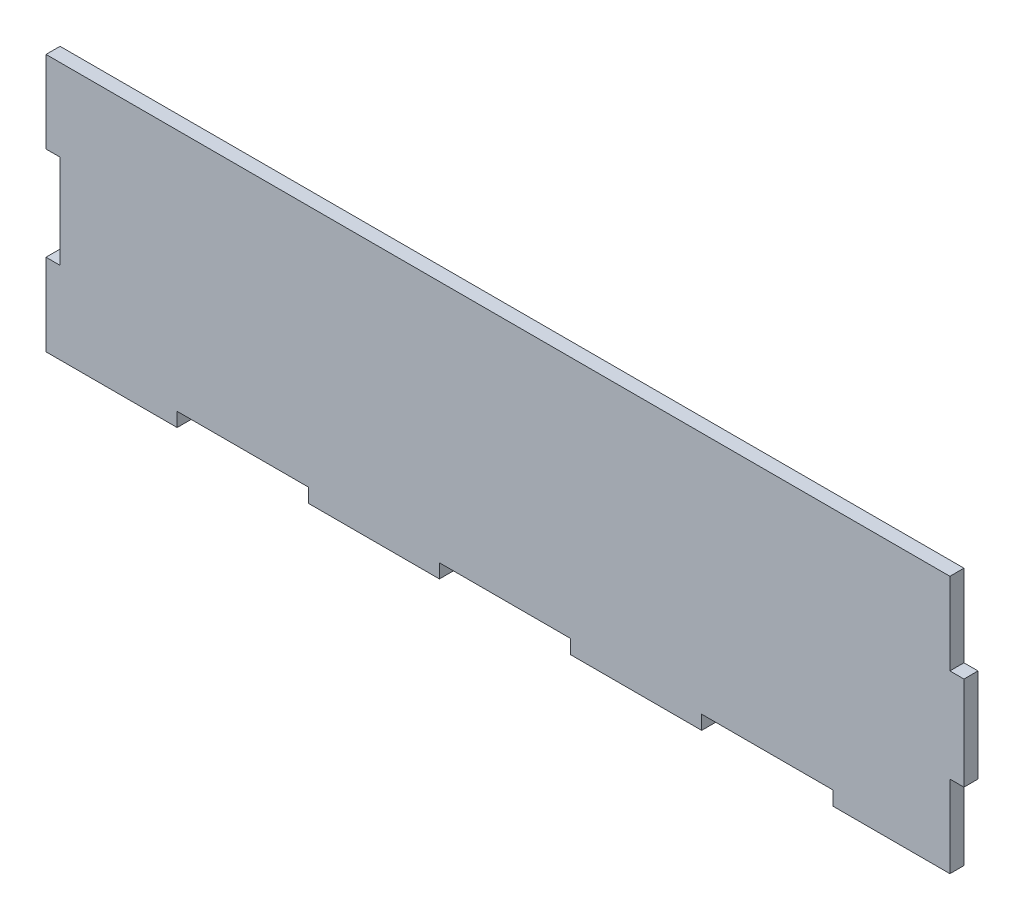
ISO-10303-21;
HEADER;
FILE_DESCRIPTION(('STEP AP214'),'2;1');
FILE_NAME('part.step','',(''),(''),'','','');
FILE_SCHEMA(('AUTOMOTIVE_DESIGN { 1 0 10303 214 1 1 1 1 }'));
ENDSEC;
DATA;
#1=APPLICATION_CONTEXT('core data for automotive mechanical design processes');
#2=APPLICATION_PROTOCOL_DEFINITION('international standard','automotive_design',2000,#1);
#3=PRODUCT_CONTEXT('',#1,'mechanical');
#4=PRODUCT('Part','Part','',(#3));
#5=PRODUCT_RELATED_PRODUCT_CATEGORY('part','',(#4));
#6=PRODUCT_DEFINITION_FORMATION('','',#4);
#7=PRODUCT_DEFINITION_CONTEXT('part definition',#1,'design');
#8=PRODUCT_DEFINITION('design','',#6,#7);
#9=PRODUCT_DEFINITION_SHAPE('','',#8);
#10=(LENGTH_UNIT() NAMED_UNIT(*) SI_UNIT(.MILLI.,.METRE.));
#11=(NAMED_UNIT(*) PLANE_ANGLE_UNIT() SI_UNIT($,.RADIAN.));
#12=(NAMED_UNIT(*) SI_UNIT($,.STERADIAN.) SOLID_ANGLE_UNIT());
#13=UNCERTAINTY_MEASURE_WITH_UNIT(LENGTH_MEASURE(1.E-05),#10,'distance_accuracy_value','');
#14=(GEOMETRIC_REPRESENTATION_CONTEXT(3) GLOBAL_UNCERTAINTY_ASSIGNED_CONTEXT((#13)) GLOBAL_UNIT_ASSIGNED_CONTEXT((#10,
#11,#12)) REPRESENTATION_CONTEXT('',''));
#15=CARTESIAN_POINT('',(0.,0.,0.));
#16=DIRECTION('',(0.,0.,1.));
#17=DIRECTION('',(1.,0.,0.));
#18=AXIS2_PLACEMENT_3D('',#15,#16,#17);
#19=CARTESIAN_POINT('',(0.,-24.4999999999999,3.));
#20=DIRECTION('',(0.,1.,0.));
#21=DIRECTION('',(0.,0.,1.));
#22=AXIS2_PLACEMENT_3D('',#19,#20,#21);
#23=PLANE('',#22);
#24=DIRECTION('',(1.,0.,0.));
#25=VECTOR('',#24,1.);
#26=CARTESIAN_POINT('',(0.,-24.4999999999999,0.));
#27=LINE('',#26,#25);
#28=CARTESIAN_POINT('',(42.,-24.4999999999999,0.));
#29=VERTEX_POINT('',#28);
#30=CARTESIAN_POINT('',(70.,-24.4999999999999,0.));
#31=VERTEX_POINT('',#30);
#32=EDGE_CURVE('E306',#29,#31,#27,.T.);
#33=ORIENTED_EDGE('',*,*,#32,.T.);
#34=DIRECTION('',(0.,0.,-1.));
#35=VECTOR('',#34,1.);
#36=CARTESIAN_POINT('',(70.,-24.4999999999999,3.));
#37=LINE('',#36,#35);
#38=CARTESIAN_POINT('',(70.,-24.4999999999999,3.));
#39=VERTEX_POINT('',#38);
#40=EDGE_CURVE('E11',#39,#31,#37,.T.);
#41=ORIENTED_EDGE('',*,*,#40,.F.);
#42=DIRECTION('',(1.,0.,0.));
#43=VECTOR('',#42,1.);
#44=CARTESIAN_POINT('',(0.,-24.4999999999999,3.));
#45=LINE('',#44,#43);
#46=CARTESIAN_POINT('',(42.,-24.4999999999999,3.));
#47=VERTEX_POINT('',#46);
#48=EDGE_CURVE('E237',#47,#39,#45,.T.);
#49=ORIENTED_EDGE('',*,*,#48,.F.);
#50=DIRECTION('',(0.,0.,-1.));
#51=VECTOR('',#50,1.);
#52=CARTESIAN_POINT('',(42.,-24.4999999999999,3.));
#53=LINE('',#52,#51);
#54=EDGE_CURVE('E224',#47,#29,#53,.T.);
#55=ORIENTED_EDGE('',*,*,#54,.T.);
#56=EDGE_LOOP('',(#33,#41,#49,#55));
#57=FACE_BOUND('',#56,.T.);
#58=ADVANCED_FACE('F34',(#57),#23,.F.);
#59=CARTESIAN_POINT('',(70.,0.,3.));
#60=DIRECTION('',(1.,0.,0.));
#61=DIRECTION('',(0.,0.,-1.));
#62=AXIS2_PLACEMENT_3D('',#59,#60,#61);
#63=PLANE('',#62);
#64=DIRECTION('',(0.,-1.,0.));
#65=VECTOR('',#64,1.);
#66=CARTESIAN_POINT('',(70.,0.,0.));
#67=LINE('',#66,#65);
#68=CARTESIAN_POINT('',(70.,-27.5,0.));
#69=VERTEX_POINT('',#68);
#70=EDGE_CURVE('E301',#31,#69,#67,.T.);
#71=ORIENTED_EDGE('',*,*,#70,.T.);
#72=DIRECTION('',(0.,0.,-1.));
#73=VECTOR('',#72,1.);
#74=CARTESIAN_POINT('',(70.,-27.5,3.));
#75=LINE('',#74,#73);
#76=CARTESIAN_POINT('',(70.,-27.5,3.));
#77=VERTEX_POINT('',#76);
#78=EDGE_CURVE('E42',#77,#69,#75,.T.);
#79=ORIENTED_EDGE('',*,*,#78,.F.);
#80=DIRECTION('',(0.,-1.,0.));
#81=VECTOR('',#80,1.);
#82=CARTESIAN_POINT('',(70.,0.,3.));
#83=LINE('',#82,#81);
#84=EDGE_CURVE('E141',#39,#77,#83,.T.);
#85=ORIENTED_EDGE('',*,*,#84,.F.);
#86=ORIENTED_EDGE('',*,*,#40,.T.);
#87=EDGE_LOOP('',(#71,#79,#85,#86));
#88=FACE_BOUND('',#87,.T.);
#89=ADVANCED_FACE('F461',(#88),#63,.F.);
#90=CARTESIAN_POINT('',(0.,-27.5,3.));
#91=DIRECTION('',(0.,1.,0.));
#92=DIRECTION('',(0.,0.,1.));
#93=AXIS2_PLACEMENT_3D('',#90,#91,#92);
#94=PLANE('',#93);
#95=DIRECTION('',(1.,0.,0.));
#96=VECTOR('',#95,1.);
#97=CARTESIAN_POINT('',(0.,-27.5,0.));
#98=LINE('',#97,#96);
#99=CARTESIAN_POINT('',(95.,-27.5,0.));
#100=VERTEX_POINT('',#99);
#101=EDGE_CURVE('E297',#69,#100,#98,.T.);
#102=ORIENTED_EDGE('',*,*,#101,.T.);
#103=DIRECTION('',(0.,0.,-1.));
#104=VECTOR('',#103,1.);
#105=CARTESIAN_POINT('',(95.,-27.5,3.));
#106=LINE('',#105,#104);
#107=CARTESIAN_POINT('',(95.,-27.5,3.));
#108=VERTEX_POINT('',#107);
#109=EDGE_CURVE('E283',#108,#100,#106,.T.);
#110=ORIENTED_EDGE('',*,*,#109,.F.);
#111=DIRECTION('',(1.,0.,0.));
#112=VECTOR('',#111,1.);
#113=CARTESIAN_POINT('',(0.,-27.5,3.));
#114=LINE('',#113,#112);
#115=EDGE_CURVE('E223',#77,#108,#114,.T.);
#116=ORIENTED_EDGE('',*,*,#115,.F.);
#117=ORIENTED_EDGE('',*,*,#78,.T.);
#118=EDGE_LOOP('',(#102,#110,#116,#117));
#119=FACE_BOUND('',#118,.T.);
#120=ADVANCED_FACE('F296',(#119),#94,.F.);
#121=CARTESIAN_POINT('',(95.,0.,3.));
#122=DIRECTION('',(1.,0.,0.));
#123=DIRECTION('',(0.,0.,-1.));
#124=AXIS2_PLACEMENT_3D('',#121,#122,#123);
#125=PLANE('',#124);
#126=DIRECTION('',(0.,-1.,0.));
#127=VECTOR('',#126,1.);
#128=CARTESIAN_POINT('',(95.,0.,0.));
#129=LINE('',#128,#127);
#130=CARTESIAN_POINT('',(95.,-10.,0.));
#131=VERTEX_POINT('',#130);
#132=EDGE_CURVE('E286',#131,#100,#129,.T.);
#133=ORIENTED_EDGE('',*,*,#132,.F.);
#134=DIRECTION('',(0.,0.,-1.));
#135=VECTOR('',#134,1.);
#136=CARTESIAN_POINT('',(95.,-10.,3.));
#137=LINE('',#136,#135);
#138=CARTESIAN_POINT('',(95.,-10.,3.));
#139=VERTEX_POINT('',#138);
#140=EDGE_CURVE('E276',#139,#131,#137,.T.);
#141=ORIENTED_EDGE('',*,*,#140,.F.);
#142=DIRECTION('',(0.,-1.,0.));
#143=VECTOR('',#142,1.);
#144=CARTESIAN_POINT('',(95.,0.,3.));
#145=LINE('',#144,#143);
#146=EDGE_CURVE('E231',#139,#108,#145,.T.);
#147=ORIENTED_EDGE('',*,*,#146,.T.);
#148=ORIENTED_EDGE('',*,*,#109,.T.);
#149=EDGE_LOOP('',(#133,#141,#147,#148));
#150=FACE_BOUND('',#149,.T.);
#151=ADVANCED_FACE('F282',(#150),#125,.T.);
#152=CARTESIAN_POINT('',(0.,-9.99999999999994,3.));
#153=DIRECTION('',(0.,-1.,0.));
#154=DIRECTION('',(1.,0.,0.));
#155=AXIS2_PLACEMENT_3D('',#152,#153,#154);
#156=PLANE('',#155);
#157=DIRECTION('',(-1.,0.,0.));
#158=VECTOR('',#157,1.);
#159=CARTESIAN_POINT('',(0.,-9.99999999999994,0.));
#160=LINE('',#159,#158);
#161=CARTESIAN_POINT('',(98.,-10.,0.));
#162=VERTEX_POINT('',#161);
#163=EDGE_CURVE('E304',#162,#131,#160,.T.);
#164=ORIENTED_EDGE('',*,*,#163,.F.);
#165=DIRECTION('',(0.,0.,-1.));
#166=VECTOR('',#165,1.);
#167=CARTESIAN_POINT('',(98.,-10.,3.));
#168=LINE('',#167,#166);
#169=CARTESIAN_POINT('',(98.,-10.,3.));
#170=VERTEX_POINT('',#169);
#171=EDGE_CURVE('E278',#170,#162,#168,.T.);
#172=ORIENTED_EDGE('',*,*,#171,.F.);
#173=DIRECTION('',(-1.,0.,0.));
#174=VECTOR('',#173,1.);
#175=CARTESIAN_POINT('',(0.,-9.99999999999994,3.));
#176=LINE('',#175,#174);
#177=EDGE_CURVE('E236',#170,#139,#176,.T.);
#178=ORIENTED_EDGE('',*,*,#177,.T.);
#179=ORIENTED_EDGE('',*,*,#140,.T.);
#180=EDGE_LOOP('',(#164,#172,#178,#179));
#181=FACE_BOUND('',#180,.T.);
#182=ADVANCED_FACE('F275',(#181),#156,.T.);
#183=CARTESIAN_POINT('',(98.,0.,3.));
#184=DIRECTION('',(-1.,0.,0.));
#185=DIRECTION('',(0.,0.,1.));
#186=AXIS2_PLACEMENT_3D('',#183,#184,#185);
#187=PLANE('',#186);
#188=DIRECTION('',(0.,1.,0.));
#189=VECTOR('',#188,1.);
#190=CARTESIAN_POINT('',(98.,0.,0.));
#191=LINE('',#190,#189);
#192=CARTESIAN_POINT('',(98.,10.,0.));
#193=VERTEX_POINT('',#192);
#194=EDGE_CURVE('E382',#162,#193,#191,.T.);
#195=ORIENTED_EDGE('',*,*,#194,.T.);
#196=DIRECTION('',(0.,0.,-1.));
#197=VECTOR('',#196,1.);
#198=CARTESIAN_POINT('',(98.,10.,3.));
#199=LINE('',#198,#197);
#200=CARTESIAN_POINT('',(98.,10.,3.));
#201=VERTEX_POINT('',#200);
#202=EDGE_CURVE('E290',#201,#193,#199,.T.);
#203=ORIENTED_EDGE('',*,*,#202,.F.);
#204=DIRECTION('',(0.,1.,0.));
#205=VECTOR('',#204,1.);
#206=CARTESIAN_POINT('',(98.,0.,3.));
#207=LINE('',#206,#205);
#208=EDGE_CURVE('E269',#170,#201,#207,.T.);
#209=ORIENTED_EDGE('',*,*,#208,.F.);
#210=ORIENTED_EDGE('',*,*,#171,.T.);
#211=EDGE_LOOP('',(#195,#203,#209,#210));
#212=FACE_BOUND('',#211,.T.);
#213=ADVANCED_FACE('F473',(#212),#187,.F.);
#214=CARTESIAN_POINT('',(0.,10.,3.));
#215=DIRECTION('',(0.,-1.,0.));
#216=DIRECTION('',(0.,0.,-1.));
#217=AXIS2_PLACEMENT_3D('',#214,#215,#216);
#218=PLANE('',#217);
#219=DIRECTION('',(-1.,0.,0.));
#220=VECTOR('',#219,1.);
#221=CARTESIAN_POINT('',(0.,10.,0.));
#222=LINE('',#221,#220);
#223=CARTESIAN_POINT('',(95.,10.,0.));
#224=VERTEX_POINT('',#223);
#225=EDGE_CURVE('E378',#193,#224,#222,.T.);
#226=ORIENTED_EDGE('',*,*,#225,.T.);
#227=DIRECTION('',(0.,0.,-1.));
#228=VECTOR('',#227,1.);
#229=CARTESIAN_POINT('',(95.,10.,3.));
#230=LINE('',#229,#228);
#231=CARTESIAN_POINT('',(95.,10.,3.));
#232=VERTEX_POINT('',#231);
#233=EDGE_CURVE('E370',#232,#224,#230,.T.);
#234=ORIENTED_EDGE('',*,*,#233,.F.);
#235=DIRECTION('',(-1.,0.,0.));
#236=VECTOR('',#235,1.);
#237=CARTESIAN_POINT('',(0.,10.,3.));
#238=LINE('',#237,#236);
#239=EDGE_CURVE('E265',#201,#232,#238,.T.);
#240=ORIENTED_EDGE('',*,*,#239,.F.);
#241=ORIENTED_EDGE('',*,*,#202,.T.);
#242=EDGE_LOOP('',(#226,#234,#240,#241));
#243=FACE_BOUND('',#242,.T.);
#244=ADVANCED_FACE('F376',(#243),#218,.F.);
#245=CARTESIAN_POINT('',(95.,0.,3.));
#246=DIRECTION('',(-1.,0.,0.));
#247=DIRECTION('',(0.,0.,1.));
#248=AXIS2_PLACEMENT_3D('',#245,#246,#247);
#249=PLANE('',#248);
#250=DIRECTION('',(0.,1.,0.));
#251=VECTOR('',#250,1.);
#252=CARTESIAN_POINT('',(95.,0.,0.));
#253=LINE('',#252,#251);
#254=CARTESIAN_POINT('',(95.,27.5,0.));
#255=VERTEX_POINT('',#254);
#256=EDGE_CURVE('E385',#224,#255,#253,.T.);
#257=ORIENTED_EDGE('',*,*,#256,.T.);
#258=DIRECTION('',(0.,0.,-1.));
#259=VECTOR('',#258,1.);
#260=CARTESIAN_POINT('',(95.,27.5,3.));
#261=LINE('',#260,#259);
#262=CARTESIAN_POINT('',(95.,27.5,3.));
#263=VERTEX_POINT('',#262);
#264=EDGE_CURVE('E368',#263,#255,#261,.T.);
#265=ORIENTED_EDGE('',*,*,#264,.F.);
#266=DIRECTION('',(0.,1.,0.));
#267=VECTOR('',#266,1.);
#268=CARTESIAN_POINT('',(95.,0.,3.));
#269=LINE('',#268,#267);
#270=EDGE_CURVE('E262',#232,#263,#269,.T.);
#271=ORIENTED_EDGE('',*,*,#270,.F.);
#272=ORIENTED_EDGE('',*,*,#233,.T.);
#273=EDGE_LOOP('',(#257,#265,#271,#272));
#274=FACE_BOUND('',#273,.T.);
#275=ADVANCED_FACE('F422',(#274),#249,.F.);
#276=CARTESIAN_POINT('',(0.,27.5,3.));
#277=DIRECTION('',(0.,1.,0.));
#278=DIRECTION('',(0.,0.,1.));
#279=AXIS2_PLACEMENT_3D('',#276,#277,#278);
#280=PLANE('',#279);
#281=DIRECTION('',(1.,0.,0.));
#282=VECTOR('',#281,1.);
#283=CARTESIAN_POINT('',(0.,27.5,0.));
#284=LINE('',#283,#282);
#285=CARTESIAN_POINT('',(-98.,27.5,0.));
#286=VERTEX_POINT('',#285);
#287=EDGE_CURVE('E387',#286,#255,#284,.T.);
#288=ORIENTED_EDGE('',*,*,#287,.F.);
#289=DIRECTION('',(0.,0.,-1.));
#290=VECTOR('',#289,1.);
#291=CARTESIAN_POINT('',(-98.,27.5,3.));
#292=LINE('',#291,#290);
#293=CARTESIAN_POINT('',(-98.,27.5,3.));
#294=VERTEX_POINT('',#293);
#295=EDGE_CURVE('E366',#294,#286,#292,.T.);
#296=ORIENTED_EDGE('',*,*,#295,.F.);
#297=DIRECTION('',(1.,0.,0.));
#298=VECTOR('',#297,1.);
#299=CARTESIAN_POINT('',(0.,27.5,3.));
#300=LINE('',#299,#298);
#301=EDGE_CURVE('E257',#294,#263,#300,.T.);
#302=ORIENTED_EDGE('',*,*,#301,.T.);
#303=ORIENTED_EDGE('',*,*,#264,.T.);
#304=EDGE_LOOP('',(#288,#296,#302,#303));
#305=FACE_BOUND('',#304,.T.);
#306=ADVANCED_FACE('F418',(#305),#280,.T.);
#307=CARTESIAN_POINT('',(-98.,0.,3.));
#308=DIRECTION('',(-1.,0.,0.));
#309=DIRECTION('',(0.,0.,1.));
#310=AXIS2_PLACEMENT_3D('',#307,#308,#309);
#311=PLANE('',#310);
#312=DIRECTION('',(0.,1.,0.));
#313=VECTOR('',#312,1.);
#314=CARTESIAN_POINT('',(-98.,0.,0.));
#315=LINE('',#314,#313);
#316=CARTESIAN_POINT('',(-98.,9.99999999999997,0.));
#317=VERTEX_POINT('',#316);
#318=EDGE_CURVE('E319',#317,#286,#315,.T.);
#319=ORIENTED_EDGE('',*,*,#318,.F.);
#320=DIRECTION('',(0.,0.,-1.));
#321=VECTOR('',#320,1.);
#322=CARTESIAN_POINT('',(-98.,9.99999999999997,3.));
#323=LINE('',#322,#321);
#324=CARTESIAN_POINT('',(-98.,9.99999999999997,3.));
#325=VERTEX_POINT('',#324);
#326=EDGE_CURVE('E364',#325,#317,#323,.T.);
#327=ORIENTED_EDGE('',*,*,#326,.F.);
#328=DIRECTION('',(0.,1.,0.));
#329=VECTOR('',#328,1.);
#330=CARTESIAN_POINT('',(-98.,0.,3.));
#331=LINE('',#330,#329);
#332=EDGE_CURVE('E248',#325,#294,#331,.T.);
#333=ORIENTED_EDGE('',*,*,#332,.T.);
#334=ORIENTED_EDGE('',*,*,#295,.T.);
#335=EDGE_LOOP('',(#319,#327,#333,#334));
#336=FACE_BOUND('',#335,.T.);
#337=ADVANCED_FACE('F417',(#336),#311,.T.);
#338=CARTESIAN_POINT('',(0.,9.99999999999997,3.));
#339=DIRECTION('',(0.,-1.,0.));
#340=DIRECTION('',(0.,0.,-1.));
#341=AXIS2_PLACEMENT_3D('',#338,#339,#340);
#342=PLANE('',#341);
#343=DIRECTION('',(-1.,0.,0.));
#344=VECTOR('',#343,1.);
#345=CARTESIAN_POINT('',(0.,9.99999999999997,0.));
#346=LINE('',#345,#344);
#347=CARTESIAN_POINT('',(-95.,9.99999999999997,0.));
#348=VERTEX_POINT('',#347);
#349=EDGE_CURVE('E394',#348,#317,#346,.T.);
#350=ORIENTED_EDGE('',*,*,#349,.F.);
#351=DIRECTION('',(0.,0.,-1.));
#352=VECTOR('',#351,1.);
#353=CARTESIAN_POINT('',(-95.,9.99999999999997,3.));
#354=LINE('',#353,#352);
#355=CARTESIAN_POINT('',(-95.,9.99999999999997,3.));
#356=VERTEX_POINT('',#355);
#357=EDGE_CURVE('E362',#356,#348,#354,.T.);
#358=ORIENTED_EDGE('',*,*,#357,.F.);
#359=DIRECTION('',(-1.,0.,0.));
#360=VECTOR('',#359,1.);
#361=CARTESIAN_POINT('',(0.,9.99999999999997,3.));
#362=LINE('',#361,#360);
#363=EDGE_CURVE('E256',#356,#325,#362,.T.);
#364=ORIENTED_EDGE('',*,*,#363,.T.);
#365=ORIENTED_EDGE('',*,*,#326,.T.);
#366=EDGE_LOOP('',(#350,#358,#364,#365));
#367=FACE_BOUND('',#366,.T.);
#368=ADVANCED_FACE('F414',(#367),#342,.T.);
#369=CARTESIAN_POINT('',(-95.,0.,3.));
#370=DIRECTION('',(-1.,0.,0.));
#371=DIRECTION('',(0.,0.,1.));
#372=AXIS2_PLACEMENT_3D('',#369,#370,#371);
#373=PLANE('',#372);
#374=DIRECTION('',(0.,1.,0.));
#375=VECTOR('',#374,1.);
#376=CARTESIAN_POINT('',(-95.,0.,0.));
#377=LINE('',#376,#375);
#378=CARTESIAN_POINT('',(-95.,-10.,0.));
#379=VERTEX_POINT('',#378);
#380=EDGE_CURVE('E397',#379,#348,#377,.T.);
#381=ORIENTED_EDGE('',*,*,#380,.F.);
#382=DIRECTION('',(0.,0.,-1.));
#383=VECTOR('',#382,1.);
#384=CARTESIAN_POINT('',(-95.,-10.,3.));
#385=LINE('',#384,#383);
#386=CARTESIAN_POINT('',(-95.,-10.,3.));
#387=VERTEX_POINT('',#386);
#388=EDGE_CURVE('E360',#387,#379,#385,.T.);
#389=ORIENTED_EDGE('',*,*,#388,.F.);
#390=DIRECTION('',(0.,1.,0.));
#391=VECTOR('',#390,1.);
#392=CARTESIAN_POINT('',(-95.,0.,3.));
#393=LINE('',#392,#391);
#394=EDGE_CURVE('E251',#387,#356,#393,.T.);
#395=ORIENTED_EDGE('',*,*,#394,.T.);
#396=ORIENTED_EDGE('',*,*,#357,.T.);
#397=EDGE_LOOP('',(#381,#389,#395,#396));
#398=FACE_BOUND('',#397,.T.);
#399=ADVANCED_FACE('F410',(#398),#373,.T.);
#400=CARTESIAN_POINT('',(0.,-10.0000000000008,3.));
#401=DIRECTION('',(0.,1.,0.));
#402=DIRECTION('',(-1.,0.,0.));
#403=AXIS2_PLACEMENT_3D('',#400,#401,#402);
#404=PLANE('',#403);
#405=DIRECTION('',(1.,0.,0.));
#406=VECTOR('',#405,1.);
#407=CARTESIAN_POINT('',(0.,-10.0000000000008,0.));
#408=LINE('',#407,#406);
#409=CARTESIAN_POINT('',(-98.,-10.,0.));
#410=VERTEX_POINT('',#409);
#411=EDGE_CURVE('E317',#410,#379,#408,.T.);
#412=ORIENTED_EDGE('',*,*,#411,.F.);
#413=DIRECTION('',(0.,0.,-1.));
#414=VECTOR('',#413,1.);
#415=CARTESIAN_POINT('',(-98.,-10.,3.));
#416=LINE('',#415,#414);
#417=CARTESIAN_POINT('',(-98.,-10.,3.));
#418=VERTEX_POINT('',#417);
#419=EDGE_CURVE('E358',#418,#410,#416,.T.);
#420=ORIENTED_EDGE('',*,*,#419,.F.);
#421=DIRECTION('',(1.,0.,0.));
#422=VECTOR('',#421,1.);
#423=CARTESIAN_POINT('',(0.,-10.0000000000008,3.));
#424=LINE('',#423,#422);
#425=EDGE_CURVE('E246',#418,#387,#424,.T.);
#426=ORIENTED_EDGE('',*,*,#425,.T.);
#427=ORIENTED_EDGE('',*,*,#388,.T.);
#428=EDGE_LOOP('',(#412,#420,#426,#427));
#429=FACE_BOUND('',#428,.T.);
#430=ADVANCED_FACE('F405',(#429),#404,.T.);
#431=CARTESIAN_POINT('',(-98.,-27.5,0.));
#432=VERTEX_POINT('',#431);
#433=EDGE_CURVE('E310',#432,#410,#315,.T.);
#434=ORIENTED_EDGE('',*,*,#433,.F.);
#435=DIRECTION('',(0.,0.,-1.));
#436=VECTOR('',#435,1.);
#437=CARTESIAN_POINT('',(-98.,-27.5,3.));
#438=LINE('',#437,#436);
#439=CARTESIAN_POINT('',(-98.,-27.5,3.));
#440=VERTEX_POINT('',#439);
#441=EDGE_CURVE('E356',#440,#432,#438,.T.);
#442=ORIENTED_EDGE('',*,*,#441,.F.);
#443=EDGE_CURVE('E239',#440,#418,#331,.T.);
#444=ORIENTED_EDGE('',*,*,#443,.T.);
#445=ORIENTED_EDGE('',*,*,#419,.T.);
#446=EDGE_LOOP('',(#434,#442,#444,#445));
#447=FACE_BOUND('',#446,.T.);
#448=ADVANCED_FACE('F488',(#447),#311,.T.);
#449=CARTESIAN_POINT('',(-70.,-27.5,0.));
#450=VERTEX_POINT('',#449);
#451=EDGE_CURVE('E303',#432,#450,#98,.T.);
#452=ORIENTED_EDGE('',*,*,#451,.T.);
#453=DIRECTION('',(0.,0.,-1.));
#454=VECTOR('',#453,1.);
#455=CARTESIAN_POINT('',(-70.,-27.5,3.));
#456=LINE('',#455,#454);
#457=CARTESIAN_POINT('',(-70.,-27.5,3.));
#458=VERTEX_POINT('',#457);
#459=EDGE_CURVE('E354',#458,#450,#456,.T.);
#460=ORIENTED_EDGE('',*,*,#459,.F.);
#461=EDGE_CURVE('E230',#440,#458,#114,.T.);
#462=ORIENTED_EDGE('',*,*,#461,.F.);
#463=ORIENTED_EDGE('',*,*,#441,.T.);
#464=EDGE_LOOP('',(#452,#460,#462,#463));
#465=FACE_BOUND('',#464,.T.);
#466=ADVANCED_FACE('F455',(#465),#94,.F.);
#467=CARTESIAN_POINT('',(-70.,0.,3.));
#468=DIRECTION('',(-1.,0.,0.));
#469=DIRECTION('',(0.,0.,1.));
#470=AXIS2_PLACEMENT_3D('',#467,#468,#469);
#471=PLANE('',#470);
#472=DIRECTION('',(0.,1.,0.));
#473=VECTOR('',#472,1.);
#474=CARTESIAN_POINT('',(-70.,0.,0.));
#475=LINE('',#474,#473);
#476=CARTESIAN_POINT('',(-70.,-24.5,0.));
#477=VERTEX_POINT('',#476);
#478=EDGE_CURVE('E309',#450,#477,#475,.T.);
#479=ORIENTED_EDGE('',*,*,#478,.T.);
#480=DIRECTION('',(0.,0.,-1.));
#481=VECTOR('',#480,1.);
#482=CARTESIAN_POINT('',(-70.,-24.5,3.));
#483=LINE('',#482,#481);
#484=CARTESIAN_POINT('',(-70.,-24.5,3.));
#485=VERTEX_POINT('',#484);
#486=EDGE_CURVE('E351',#485,#477,#483,.T.);
#487=ORIENTED_EDGE('',*,*,#486,.F.);
#488=DIRECTION('',(0.,1.,0.));
#489=VECTOR('',#488,1.);
#490=CARTESIAN_POINT('',(-70.,0.,3.));
#491=LINE('',#490,#489);
#492=EDGE_CURVE('E238',#458,#485,#491,.T.);
#493=ORIENTED_EDGE('',*,*,#492,.F.);
#494=ORIENTED_EDGE('',*,*,#459,.T.);
#495=EDGE_LOOP('',(#479,#487,#493,#494));
#496=FACE_BOUND('',#495,.T.);
#497=ADVANCED_FACE('F456',(#496),#471,.F.);
#498=CARTESIAN_POINT('',(0.,-24.5,3.));
#499=DIRECTION('',(0.,1.,0.));
#500=DIRECTION('',(0.,0.,1.));
#501=AXIS2_PLACEMENT_3D('',#498,#499,#500);
#502=PLANE('',#501);
#503=DIRECTION('',(1.,0.,0.));
#504=VECTOR('',#503,1.);
#505=CARTESIAN_POINT('',(0.,-24.5,0.));
#506=LINE('',#505,#504);
#507=CARTESIAN_POINT('',(-42.,-24.5,0.));
#508=VERTEX_POINT('',#507);
#509=EDGE_CURVE('E314',#477,#508,#506,.T.);
#510=ORIENTED_EDGE('',*,*,#509,.T.);
#511=DIRECTION('',(0.,0.,-1.));
#512=VECTOR('',#511,1.);
#513=CARTESIAN_POINT('',(-42.,-24.5,3.));
#514=LINE('',#513,#512);
#515=CARTESIAN_POINT('',(-42.,-24.5,3.));
#516=VERTEX_POINT('',#515);
#517=EDGE_CURVE('E349',#516,#508,#514,.T.);
#518=ORIENTED_EDGE('',*,*,#517,.F.);
#519=DIRECTION('',(1.,0.,0.));
#520=VECTOR('',#519,1.);
#521=CARTESIAN_POINT('',(0.,-24.5,3.));
#522=LINE('',#521,#520);
#523=EDGE_CURVE('E243',#485,#516,#522,.T.);
#524=ORIENTED_EDGE('',*,*,#523,.F.);
#525=ORIENTED_EDGE('',*,*,#486,.T.);
#526=EDGE_LOOP('',(#510,#518,#524,#525));
#527=FACE_BOUND('',#526,.T.);
#528=ADVANCED_FACE('F448',(#527),#502,.F.);
#529=CARTESIAN_POINT('',(-42.,0.,3.));
#530=DIRECTION('',(1.,0.,0.));
#531=DIRECTION('',(0.,0.,-1.));
#532=AXIS2_PLACEMENT_3D('',#529,#530,#531);
#533=PLANE('',#532);
#534=DIRECTION('',(0.,-1.,0.));
#535=VECTOR('',#534,1.);
#536=CARTESIAN_POINT('',(-42.,0.,0.));
#537=LINE('',#536,#535);
#538=CARTESIAN_POINT('',(-42.,-27.5,0.));
#539=VERTEX_POINT('',#538);
#540=EDGE_CURVE('E321',#508,#539,#537,.T.);
#541=ORIENTED_EDGE('',*,*,#540,.T.);
#542=DIRECTION('',(0.,0.,-1.));
#543=VECTOR('',#542,1.);
#544=CARTESIAN_POINT('',(-42.,-27.5,3.));
#545=LINE('',#544,#543);
#546=CARTESIAN_POINT('',(-42.,-27.5,3.));
#547=VERTEX_POINT('',#546);
#548=EDGE_CURVE('E347',#547,#539,#545,.T.);
#549=ORIENTED_EDGE('',*,*,#548,.F.);
#550=DIRECTION('',(0.,-1.,0.));
#551=VECTOR('',#550,1.);
#552=CARTESIAN_POINT('',(-42.,0.,3.));
#553=LINE('',#552,#551);
#554=EDGE_CURVE('E229',#516,#547,#553,.T.);
#555=ORIENTED_EDGE('',*,*,#554,.F.);
#556=ORIENTED_EDGE('',*,*,#517,.T.);
#557=EDGE_LOOP('',(#541,#549,#555,#556));
#558=FACE_BOUND('',#557,.T.);
#559=ADVANCED_FACE('F446',(#558),#533,.F.);
#560=CARTESIAN_POINT('',(-14.,-27.5,0.));
#561=VERTEX_POINT('',#560);
#562=EDGE_CURVE('E308',#539,#561,#98,.T.);
#563=ORIENTED_EDGE('',*,*,#562,.T.);
#564=DIRECTION('',(0.,0.,-1.));
#565=VECTOR('',#564,1.);
#566=CARTESIAN_POINT('',(-14.,-27.5,3.));
#567=LINE('',#566,#565);
#568=CARTESIAN_POINT('',(-14.,-27.5,3.));
#569=VERTEX_POINT('',#568);
#570=EDGE_CURVE('E345',#569,#561,#567,.T.);
#571=ORIENTED_EDGE('',*,*,#570,.F.);
#572=EDGE_CURVE('E222',#547,#569,#114,.T.);
#573=ORIENTED_EDGE('',*,*,#572,.F.);
#574=ORIENTED_EDGE('',*,*,#548,.T.);
#575=EDGE_LOOP('',(#563,#571,#573,#574));
#576=FACE_BOUND('',#575,.T.);
#577=ADVANCED_FACE('F442',(#576),#94,.F.);
#578=CARTESIAN_POINT('',(-14.,0.,3.));
#579=DIRECTION('',(-1.,0.,0.));
#580=DIRECTION('',(0.,0.,1.));
#581=AXIS2_PLACEMENT_3D('',#578,#579,#580);
#582=PLANE('',#581);
#583=DIRECTION('',(0.,1.,0.));
#584=VECTOR('',#583,1.);
#585=CARTESIAN_POINT('',(-14.,0.,0.));
#586=LINE('',#585,#584);
#587=CARTESIAN_POINT('',(-14.,-24.5,0.));
#588=VERTEX_POINT('',#587);
#589=EDGE_CURVE('E320',#561,#588,#586,.T.);
#590=ORIENTED_EDGE('',*,*,#589,.T.);
#591=DIRECTION('',(0.,0.,-1.));
#592=VECTOR('',#591,1.);
#593=CARTESIAN_POINT('',(-14.,-24.5,3.));
#594=LINE('',#593,#592);
#595=CARTESIAN_POINT('',(-14.,-24.5,3.));
#596=VERTEX_POINT('',#595);
#597=EDGE_CURVE('E342',#596,#588,#594,.T.);
#598=ORIENTED_EDGE('',*,*,#597,.F.);
#599=DIRECTION('',(0.,1.,0.));
#600=VECTOR('',#599,1.);
#601=CARTESIAN_POINT('',(-14.,0.,3.));
#602=LINE('',#601,#600);
#603=EDGE_CURVE('E228',#569,#596,#602,.T.);
#604=ORIENTED_EDGE('',*,*,#603,.F.);
#605=ORIENTED_EDGE('',*,*,#570,.T.);
#606=EDGE_LOOP('',(#590,#598,#604,#605));
#607=FACE_BOUND('',#606,.T.);
#608=ADVANCED_FACE('F440',(#607),#582,.F.);
#609=CARTESIAN_POINT('',(0.,-24.5,3.));
#610=DIRECTION('',(0.,1.,0.));
#611=DIRECTION('',(0.,0.,1.));
#612=AXIS2_PLACEMENT_3D('',#609,#610,#611);
#613=PLANE('',#612);
#614=DIRECTION('',(1.,0.,0.));
#615=VECTOR('',#614,1.);
#616=CARTESIAN_POINT('',(0.,-24.5,0.));
#617=LINE('',#616,#615);
#618=CARTESIAN_POINT('',(14.,-24.5,0.));
#619=VERTEX_POINT('',#618);
#620=EDGE_CURVE('E327',#588,#619,#617,.T.);
#621=ORIENTED_EDGE('',*,*,#620,.T.);
#622=DIRECTION('',(0.,0.,-1.));
#623=VECTOR('',#622,1.);
#624=CARTESIAN_POINT('',(14.,-24.5,3.));
#625=LINE('',#624,#623);
#626=CARTESIAN_POINT('',(14.,-24.5,3.));
#627=VERTEX_POINT('',#626);
#628=EDGE_CURVE('E217',#627,#619,#625,.T.);
#629=ORIENTED_EDGE('',*,*,#628,.F.);
#630=DIRECTION('',(1.,0.,0.));
#631=VECTOR('',#630,1.);
#632=CARTESIAN_POINT('',(0.,-24.5,3.));
#633=LINE('',#632,#631);
#634=EDGE_CURVE('E208',#596,#627,#633,.T.);
#635=ORIENTED_EDGE('',*,*,#634,.F.);
#636=ORIENTED_EDGE('',*,*,#597,.T.);
#637=EDGE_LOOP('',(#621,#629,#635,#636));
#638=FACE_BOUND('',#637,.T.);
#639=ADVANCED_FACE('F436',(#638),#613,.F.);
#640=CARTESIAN_POINT('',(14.,0.,3.));
#641=DIRECTION('',(1.,0.,0.));
#642=DIRECTION('',(0.,1.,0.));
#643=AXIS2_PLACEMENT_3D('',#640,#641,#642);
#644=PLANE('',#643);
#645=DIRECTION('',(0.,-1.,0.));
#646=VECTOR('',#645,1.);
#647=CARTESIAN_POINT('',(14.,0.,0.));
#648=LINE('',#647,#646);
#649=CARTESIAN_POINT('',(14.,-27.5,0.));
#650=VERTEX_POINT('',#649);
#651=EDGE_CURVE('E216',#619,#650,#648,.T.);
#652=ORIENTED_EDGE('',*,*,#651,.T.);
#653=DIRECTION('',(0.,0.,-1.));
#654=VECTOR('',#653,1.);
#655=CARTESIAN_POINT('',(14.,-27.5,3.));
#656=LINE('',#655,#654);
#657=CARTESIAN_POINT('',(14.,-27.5,3.));
#658=VERTEX_POINT('',#657);
#659=EDGE_CURVE('E213',#658,#650,#656,.T.);
#660=ORIENTED_EDGE('',*,*,#659,.F.);
#661=DIRECTION('',(0.,-1.,0.));
#662=VECTOR('',#661,1.);
#663=CARTESIAN_POINT('',(14.,0.,3.));
#664=LINE('',#663,#662);
#665=EDGE_CURVE('E202',#627,#658,#664,.T.);
#666=ORIENTED_EDGE('',*,*,#665,.F.);
#667=ORIENTED_EDGE('',*,*,#628,.T.);
#668=EDGE_LOOP('',(#652,#660,#666,#667));
#669=FACE_BOUND('',#668,.T.);
#670=ADVANCED_FACE('F214',(#669),#644,.F.);
#671=CARTESIAN_POINT('',(42.,-27.5,0.));
#672=VERTEX_POINT('',#671);
#673=EDGE_CURVE('E127',#650,#672,#98,.T.);
#674=ORIENTED_EDGE('',*,*,#673,.T.);
#675=DIRECTION('',(0.,0.,-1.));
#676=VECTOR('',#675,1.);
#677=CARTESIAN_POINT('',(42.,-27.5,3.));
#678=LINE('',#677,#676);
#679=CARTESIAN_POINT('',(42.,-27.5,3.));
#680=VERTEX_POINT('',#679);
#681=EDGE_CURVE('E218',#680,#672,#678,.T.);
#682=ORIENTED_EDGE('',*,*,#681,.F.);
#683=EDGE_CURVE('E206',#658,#680,#114,.T.);
#684=ORIENTED_EDGE('',*,*,#683,.F.);
#685=ORIENTED_EDGE('',*,*,#659,.T.);
#686=EDGE_LOOP('',(#674,#682,#684,#685));
#687=FACE_BOUND('',#686,.T.);
#688=ADVANCED_FACE('F220',(#687),#94,.F.);
#689=CARTESIAN_POINT('',(42.,0.,3.));
#690=DIRECTION('',(-1.,0.,0.));
#691=DIRECTION('',(0.,0.,1.));
#692=AXIS2_PLACEMENT_3D('',#689,#690,#691);
#693=PLANE('',#692);
#694=DIRECTION('',(0.,1.,0.));
#695=VECTOR('',#694,1.);
#696=CARTESIAN_POINT('',(42.,0.,0.));
#697=LINE('',#696,#695);
#698=EDGE_CURVE('E133',#672,#29,#697,.T.);
#699=ORIENTED_EDGE('',*,*,#698,.T.);
#700=ORIENTED_EDGE('',*,*,#54,.F.);
#701=DIRECTION('',(0.,1.,0.));
#702=VECTOR('',#701,1.);
#703=CARTESIAN_POINT('',(42.,0.,3.));
#704=LINE('',#703,#702);
#705=EDGE_CURVE('E50',#680,#47,#704,.T.);
#706=ORIENTED_EDGE('',*,*,#705,.F.);
#707=ORIENTED_EDGE('',*,*,#681,.T.);
#708=EDGE_LOOP('',(#699,#700,#706,#707));
#709=FACE_BOUND('',#708,.T.);
#710=ADVANCED_FACE('F505',(#709),#693,.F.);
#711=CARTESIAN_POINT('',(0.,0.,3.));
#712=DIRECTION('',(0.,0.,1.));
#713=DIRECTION('',(1.,0.,0.));
#714=AXIS2_PLACEMENT_3D('',#711,#712,#713);
#715=PLANE('',#714);
#716=ORIENTED_EDGE('',*,*,#48,.T.);
#717=ORIENTED_EDGE('',*,*,#84,.T.);
#718=ORIENTED_EDGE('',*,*,#115,.T.);
#719=ORIENTED_EDGE('',*,*,#146,.F.);
#720=ORIENTED_EDGE('',*,*,#177,.F.);
#721=ORIENTED_EDGE('',*,*,#208,.T.);
#722=ORIENTED_EDGE('',*,*,#239,.T.);
#723=ORIENTED_EDGE('',*,*,#270,.T.);
#724=ORIENTED_EDGE('',*,*,#301,.F.);
#725=ORIENTED_EDGE('',*,*,#332,.F.);
#726=ORIENTED_EDGE('',*,*,#363,.F.);
#727=ORIENTED_EDGE('',*,*,#394,.F.);
#728=ORIENTED_EDGE('',*,*,#425,.F.);
#729=ORIENTED_EDGE('',*,*,#443,.F.);
#730=ORIENTED_EDGE('',*,*,#461,.T.);
#731=ORIENTED_EDGE('',*,*,#492,.T.);
#732=ORIENTED_EDGE('',*,*,#523,.T.);
#733=ORIENTED_EDGE('',*,*,#554,.T.);
#734=ORIENTED_EDGE('',*,*,#572,.T.);
#735=ORIENTED_EDGE('',*,*,#603,.T.);
#736=ORIENTED_EDGE('',*,*,#634,.T.);
#737=ORIENTED_EDGE('',*,*,#665,.T.);
#738=ORIENTED_EDGE('',*,*,#683,.T.);
#739=ORIENTED_EDGE('',*,*,#705,.T.);
#740=EDGE_LOOP('',(#716,#717,#718,#719,#720,#721,#722,#723,#724,#725,#726,#727,#728,#729,#730,
#731,#732,#733,#734,#735,#736,#737,#738,#739));
#741=FACE_BOUND('',#740,.T.);
#742=ADVANCED_FACE('F204',(#741),#715,.T.);
#743=CARTESIAN_POINT('',(0.,0.,0.));
#744=DIRECTION('',(0.,0.,1.));
#745=DIRECTION('',(1.,0.,0.));
#746=AXIS2_PLACEMENT_3D('',#743,#744,#745);
#747=PLANE('',#746);
#748=ORIENTED_EDGE('',*,*,#32,.F.);
#749=ORIENTED_EDGE('',*,*,#698,.F.);
#750=ORIENTED_EDGE('',*,*,#673,.F.);
#751=ORIENTED_EDGE('',*,*,#651,.F.);
#752=ORIENTED_EDGE('',*,*,#620,.F.);
#753=ORIENTED_EDGE('',*,*,#589,.F.);
#754=ORIENTED_EDGE('',*,*,#562,.F.);
#755=ORIENTED_EDGE('',*,*,#540,.F.);
#756=ORIENTED_EDGE('',*,*,#509,.F.);
#757=ORIENTED_EDGE('',*,*,#478,.F.);
#758=ORIENTED_EDGE('',*,*,#451,.F.);
#759=ORIENTED_EDGE('',*,*,#433,.T.);
#760=ORIENTED_EDGE('',*,*,#411,.T.);
#761=ORIENTED_EDGE('',*,*,#380,.T.);
#762=ORIENTED_EDGE('',*,*,#349,.T.);
#763=ORIENTED_EDGE('',*,*,#318,.T.);
#764=ORIENTED_EDGE('',*,*,#287,.T.);
#765=ORIENTED_EDGE('',*,*,#256,.F.);
#766=ORIENTED_EDGE('',*,*,#225,.F.);
#767=ORIENTED_EDGE('',*,*,#194,.F.);
#768=ORIENTED_EDGE('',*,*,#163,.T.);
#769=ORIENTED_EDGE('',*,*,#132,.T.);
#770=ORIENTED_EDGE('',*,*,#101,.F.);
#771=ORIENTED_EDGE('',*,*,#70,.F.);
#772=EDGE_LOOP('',(#748,#749,#750,#751,#752,#753,#754,#755,#756,#757,#758,#759,#760,#761,#762,
#763,#764,#765,#766,#767,#768,#769,#770,#771));
#773=FACE_BOUND('',#772,.T.);
#774=ADVANCED_FACE('F300',(#773),#747,.F.);
#775=CLOSED_SHELL('',(#58,#89,#120,#151,#182,#213,#244,#275,#306,#337,#368,#399,#430,#448,#466,
#497,#528,#559,#577,#608,#639,#670,#688,#710,#742,#774));
#776=MANIFOLD_SOLID_BREP('B2',#775);
#777=ADVANCED_BREP_SHAPE_REPRESENTATION('',(#18,#776),#14);
#778=SHAPE_DEFINITION_REPRESENTATION(#9,#777);
ENDSEC;
END-ISO-10303-21;
